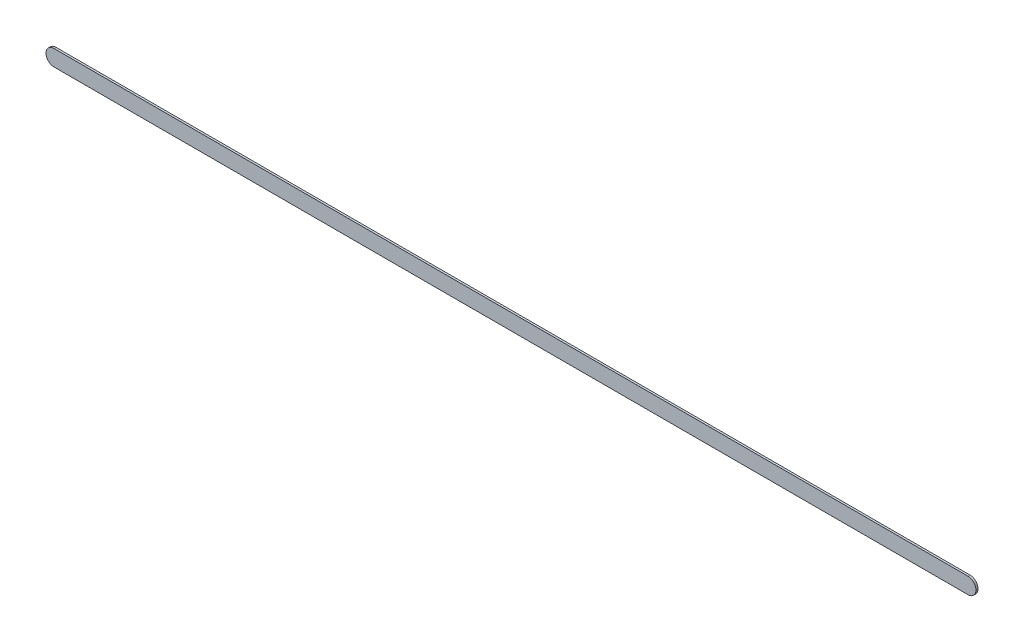
ISO-10303-21;
HEADER;
FILE_DESCRIPTION(('STEP AP214'),'2;1');
FILE_NAME('part.step','',(''),(''),'','','');
FILE_SCHEMA(('AUTOMOTIVE_DESIGN { 1 0 10303 214 1 1 1 1 }'));
ENDSEC;
DATA;
#1=APPLICATION_CONTEXT('core data for automotive mechanical design processes');
#2=APPLICATION_PROTOCOL_DEFINITION('international standard','automotive_design',2000,#1);
#3=PRODUCT_CONTEXT('',#1,'mechanical');
#4=PRODUCT('Part','Part','',(#3));
#5=PRODUCT_RELATED_PRODUCT_CATEGORY('part','',(#4));
#6=PRODUCT_DEFINITION_FORMATION('','',#4);
#7=PRODUCT_DEFINITION_CONTEXT('part definition',#1,'design');
#8=PRODUCT_DEFINITION('design','',#6,#7);
#9=PRODUCT_DEFINITION_SHAPE('','',#8);
#10=(LENGTH_UNIT() NAMED_UNIT(*) SI_UNIT(.MILLI.,.METRE.));
#11=(NAMED_UNIT(*) PLANE_ANGLE_UNIT() SI_UNIT($,.RADIAN.));
#12=(NAMED_UNIT(*) SI_UNIT($,.STERADIAN.) SOLID_ANGLE_UNIT());
#13=UNCERTAINTY_MEASURE_WITH_UNIT(LENGTH_MEASURE(1.E-05),#10,'distance_accuracy_value','');
#14=(GEOMETRIC_REPRESENTATION_CONTEXT(3) GLOBAL_UNCERTAINTY_ASSIGNED_CONTEXT((#13)) GLOBAL_UNIT_ASSIGNED_CONTEXT((#10,
#11,#12)) REPRESENTATION_CONTEXT('',''));
#15=CARTESIAN_POINT('',(0.,0.,0.));
#16=DIRECTION('',(0.,0.,1.));
#17=DIRECTION('',(1.,0.,0.));
#18=AXIS2_PLACEMENT_3D('',#15,#16,#17);
#19=CARTESIAN_POINT('',(9.625100097656,55.486499023437,1.1723000001));
#20=DIRECTION('',(0.,0.,1.));
#21=DIRECTION('',(1.,0.,0.));
#22=AXIS2_PLACEMENT_3D('',#19,#20,#21);
#23=PLANE('',#22);
#24=CARTESIAN_POINT('',(6.775100097656,55.486499023437,1.1723000001));
#25=DIRECTION('',(0.,0.,-1.));
#26=DIRECTION('',(1.,0.,0.));
#27=AXIS2_PLACEMENT_3D('',#24,#25,#26);
#28=CIRCLE('',#27,0.05);
#29=CARTESIAN_POINT('',(6.775100097656,55.436499023438,1.1723000001));
#30=VERTEX_POINT('',#29);
#31=CARTESIAN_POINT('',(6.775100097656,55.536499023438,1.1723000001));
#32=VERTEX_POINT('',#31);
#33=EDGE_CURVE('E126',#30,#32,#28,.T.);
#34=ORIENTED_EDGE('',*,*,#33,.F.);
#35=DIRECTION('',(1.,0.,0.));
#36=VECTOR('',#35,1.);
#37=CARTESIAN_POINT('',(12.475100097656,55.436499023438,1.1723000001));
#38=LINE('',#37,#36);
#39=CARTESIAN_POINT('',(12.475100097656,55.436499023438,1.1723000001));
#40=VERTEX_POINT('',#39);
#41=EDGE_CURVE('E21',#30,#40,#38,.T.);
#42=ORIENTED_EDGE('',*,*,#41,.T.);
#43=CARTESIAN_POINT('',(12.475100097656,55.486499023437,1.1723000001));
#44=DIRECTION('',(0.,0.,1.));
#45=DIRECTION('',(1.,0.,0.));
#46=AXIS2_PLACEMENT_3D('',#43,#44,#45);
#47=CIRCLE('',#46,0.05);
#48=CARTESIAN_POINT('',(12.525100097656,55.486499023437,1.1723000001));
#49=VERTEX_POINT('',#48);
#50=EDGE_CURVE('E104',#40,#49,#47,.T.);
#51=ORIENTED_EDGE('',*,*,#50,.T.);
#52=CARTESIAN_POINT('',(12.475100097656,55.486499023437,1.1723000001));
#53=DIRECTION('',(0.,0.,1.));
#54=DIRECTION('',(1.,0.,0.));
#55=AXIS2_PLACEMENT_3D('',#52,#53,#54);
#56=CIRCLE('',#55,0.05);
#57=CARTESIAN_POINT('',(12.475100097656,55.536499023438,1.1723000001));
#58=VERTEX_POINT('',#57);
#59=EDGE_CURVE('E99',#49,#58,#56,.T.);
#60=ORIENTED_EDGE('',*,*,#59,.T.);
#61=DIRECTION('',(-1.,0.,0.));
#62=VECTOR('',#61,1.);
#63=CARTESIAN_POINT('',(6.775100097656,55.536499023438,1.1723000001));
#64=LINE('',#63,#62);
#65=EDGE_CURVE('E11',#58,#32,#64,.T.);
#66=ORIENTED_EDGE('',*,*,#65,.T.);
#67=EDGE_LOOP('',(#34,#42,#51,#60,#66));
#68=FACE_BOUND('',#67,.T.);
#69=ADVANCED_FACE('F17',(#68),#23,.T.);
#70=CARTESIAN_POINT('',(6.775100097656,55.536499023438,1.1596000001));
#71=DIRECTION('',(0.,-1.,0.));
#72=DIRECTION('',(0.,0.,-1.));
#73=AXIS2_PLACEMENT_3D('',#70,#71,#72);
#74=PLANE('',#73);
#75=DIRECTION('',(0.,0.,1.));
#76=VECTOR('',#75,1.);
#77=CARTESIAN_POINT('',(12.475100097656,55.536499023438,1.1596000001));
#78=LINE('',#77,#76);
#79=CARTESIAN_POINT('',(12.475100097656,55.536499023438,1.1596000001));
#80=VERTEX_POINT('',#79);
#81=EDGE_CURVE('E94',#80,#58,#78,.T.);
#82=ORIENTED_EDGE('',*,*,#81,.F.);
#83=DIRECTION('',(-1.,0.,0.));
#84=VECTOR('',#83,1.);
#85=CARTESIAN_POINT('',(9.625100097656,55.536499023438,1.1596000001));
#86=LINE('',#85,#84);
#87=CARTESIAN_POINT('',(6.775100097656,55.536499023438,1.1596000001));
#88=VERTEX_POINT('',#87);
#89=EDGE_CURVE('E90',#80,#88,#86,.T.);
#90=ORIENTED_EDGE('',*,*,#89,.T.);
#91=DIRECTION('',(0.,0.,-1.));
#92=VECTOR('',#91,1.);
#93=CARTESIAN_POINT('',(6.775100097656,55.536499023438,1.1596000001));
#94=LINE('',#93,#92);
#95=EDGE_CURVE('E28',#32,#88,#94,.T.);
#96=ORIENTED_EDGE('',*,*,#95,.F.);
#97=ORIENTED_EDGE('',*,*,#65,.F.);
#98=EDGE_LOOP('',(#82,#90,#96,#97));
#99=FACE_BOUND('',#98,.T.);
#100=ADVANCED_FACE('F150',(#99),#74,.F.);
#101=CARTESIAN_POINT('',(6.775100097656,55.486499023437,1.1596000001));
#102=DIRECTION('',(0.,0.,1.));
#103=DIRECTION('',(1.,0.,0.));
#104=AXIS2_PLACEMENT_3D('',#101,#102,#103);
#105=CYLINDRICAL_SURFACE('',#104,0.05);
#106=CARTESIAN_POINT('',(6.775100097656,55.486499023437,1.1596000001));
#107=DIRECTION('',(0.,0.,1.));
#108=DIRECTION('',(1.,0.,0.));
#109=AXIS2_PLACEMENT_3D('',#106,#107,#108);
#110=CIRCLE('',#109,0.05);
#111=CARTESIAN_POINT('',(6.775100097656,55.436499023438,1.1596000001));
#112=VERTEX_POINT('',#111);
#113=EDGE_CURVE('E122',#88,#112,#110,.T.);
#114=ORIENTED_EDGE('',*,*,#113,.T.);
#115=DIRECTION('',(0.,0.,1.));
#116=VECTOR('',#115,1.);
#117=CARTESIAN_POINT('',(6.775100097656,55.436499023438,1.1596000001));
#118=LINE('',#117,#116);
#119=EDGE_CURVE('E135',#112,#30,#118,.T.);
#120=ORIENTED_EDGE('',*,*,#119,.T.);
#121=ORIENTED_EDGE('',*,*,#33,.T.);
#122=ORIENTED_EDGE('',*,*,#95,.T.);
#123=EDGE_LOOP('',(#114,#120,#121,#122));
#124=FACE_BOUND('',#123,.T.);
#125=ADVANCED_FACE('F19',(#124),#105,.T.);
#126=CARTESIAN_POINT('',(12.475100097656,55.436499023438,1.1596000001));
#127=DIRECTION('',(0.,1.,0.));
#128=DIRECTION('',(1.,0.,0.));
#129=AXIS2_PLACEMENT_3D('',#126,#127,#128);
#130=PLANE('',#129);
#131=ORIENTED_EDGE('',*,*,#119,.F.);
#132=DIRECTION('',(1.,0.,0.));
#133=VECTOR('',#132,1.);
#134=CARTESIAN_POINT('',(9.625100097656,55.436499023438,1.1596000001));
#135=LINE('',#134,#133);
#136=CARTESIAN_POINT('',(12.475100097656,55.436499023438,1.1596000001));
#137=VERTEX_POINT('',#136);
#138=EDGE_CURVE('E74',#112,#137,#135,.T.);
#139=ORIENTED_EDGE('',*,*,#138,.T.);
#140=DIRECTION('',(0.,0.,-1.));
#141=VECTOR('',#140,1.);
#142=CARTESIAN_POINT('',(12.475100097656,55.436499023437,1.1596000001));
#143=LINE('',#142,#141);
#144=EDGE_CURVE('E107',#40,#137,#143,.T.);
#145=ORIENTED_EDGE('',*,*,#144,.F.);
#146=ORIENTED_EDGE('',*,*,#41,.F.);
#147=EDGE_LOOP('',(#131,#139,#145,#146));
#148=FACE_BOUND('',#147,.T.);
#149=ADVANCED_FACE('F165',(#148),#130,.F.);
#150=CARTESIAN_POINT('',(12.475100097656,55.486499023437,1.1596000001));
#151=DIRECTION('',(0.,0.,1.));
#152=DIRECTION('',(1.,0.,0.));
#153=AXIS2_PLACEMENT_3D('',#150,#151,#152);
#154=CYLINDRICAL_SURFACE('',#153,0.05);
#155=DIRECTION('',(0.,0.,1.));
#156=VECTOR('',#155,1.);
#157=CARTESIAN_POINT('',(12.525100097656,55.486499023437,1.1596000001));
#158=LINE('',#157,#156);
#159=CARTESIAN_POINT('',(12.525100097656,55.486499023437,1.1596000001));
#160=VERTEX_POINT('',#159);
#161=EDGE_CURVE('E97',#160,#49,#158,.T.);
#162=ORIENTED_EDGE('',*,*,#161,.F.);
#163=CARTESIAN_POINT('',(12.475100097656,55.486499023437,1.1596000001));
#164=DIRECTION('',(0.,0.,1.));
#165=DIRECTION('',(1.,0.,0.));
#166=AXIS2_PLACEMENT_3D('',#163,#164,#165);
#167=CIRCLE('',#166,0.05);
#168=EDGE_CURVE('E83',#160,#80,#167,.T.);
#169=ORIENTED_EDGE('',*,*,#168,.T.);
#170=ORIENTED_EDGE('',*,*,#81,.T.);
#171=ORIENTED_EDGE('',*,*,#59,.F.);
#172=EDGE_LOOP('',(#162,#169,#170,#171));
#173=FACE_BOUND('',#172,.T.);
#174=ADVANCED_FACE('F98',(#173),#154,.T.);
#175=CARTESIAN_POINT('',(9.625100097656,55.486499023437,1.1596000001));
#176=DIRECTION('',(0.,0.,1.));
#177=DIRECTION('',(1.,0.,0.));
#178=AXIS2_PLACEMENT_3D('',#175,#176,#177);
#179=PLANE('',#178);
#180=ORIENTED_EDGE('',*,*,#138,.F.);
#181=ORIENTED_EDGE('',*,*,#113,.F.);
#182=ORIENTED_EDGE('',*,*,#89,.F.);
#183=ORIENTED_EDGE('',*,*,#168,.F.);
#184=CARTESIAN_POINT('',(12.475100097656,55.486499023437,1.1596000001));
#185=DIRECTION('',(0.,0.,1.));
#186=DIRECTION('',(1.,0.,0.));
#187=AXIS2_PLACEMENT_3D('',#184,#185,#186);
#188=CIRCLE('',#187,0.05);
#189=EDGE_CURVE('E87',#137,#160,#188,.T.);
#190=ORIENTED_EDGE('',*,*,#189,.F.);
#191=EDGE_LOOP('',(#180,#181,#182,#183,#190));
#192=FACE_BOUND('',#191,.T.);
#193=ADVANCED_FACE('F85',(#192),#179,.F.);
#194=CARTESIAN_POINT('',(12.475100097656,55.486499023437,1.1596000001));
#195=DIRECTION('',(0.,0.,1.));
#196=DIRECTION('',(1.,0.,0.));
#197=AXIS2_PLACEMENT_3D('',#194,#195,#196);
#198=CYLINDRICAL_SURFACE('',#197,0.05);
#199=ORIENTED_EDGE('',*,*,#189,.T.);
#200=ORIENTED_EDGE('',*,*,#161,.T.);
#201=ORIENTED_EDGE('',*,*,#50,.F.);
#202=ORIENTED_EDGE('',*,*,#144,.T.);
#203=EDGE_LOOP('',(#199,#200,#201,#202));
#204=FACE_BOUND('',#203,.T.);
#205=ADVANCED_FACE('F106',(#204),#198,.T.);
#206=CLOSED_SHELL('',(#69,#100,#125,#149,#174,#193,#205));
#207=MANIFOLD_SOLID_BREP('B1',#206);
#208=ADVANCED_BREP_SHAPE_REPRESENTATION('',(#18,#207),#14);
#209=SHAPE_DEFINITION_REPRESENTATION(#9,#208);
ENDSEC;
END-ISO-10303-21;
